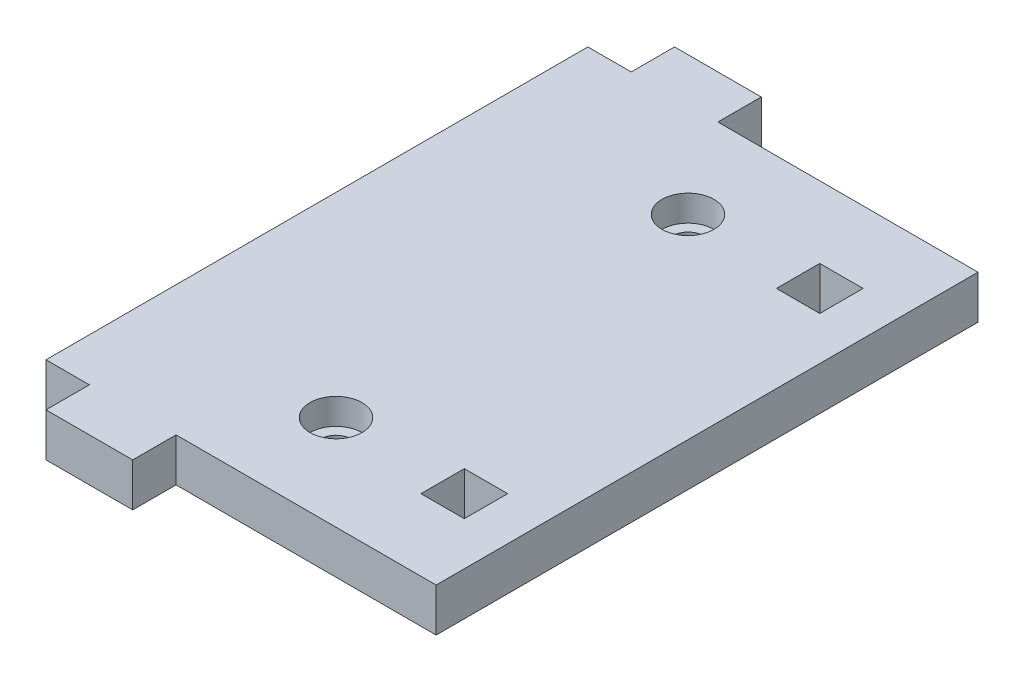
ISO-10303-21;
HEADER;
FILE_DESCRIPTION(('STEP AP214'),'2;1');
FILE_NAME('part.step','',(''),(''),'','','');
FILE_SCHEMA(('AUTOMOTIVE_DESIGN { 1 0 10303 214 1 1 1 1 }'));
ENDSEC;
DATA;
#1=APPLICATION_CONTEXT('core data for automotive mechanical design processes');
#2=APPLICATION_PROTOCOL_DEFINITION('international standard','automotive_design',2000,#1);
#3=PRODUCT_CONTEXT('',#1,'mechanical');
#4=PRODUCT('Part','Part','',(#3));
#5=PRODUCT_RELATED_PRODUCT_CATEGORY('part','',(#4));
#6=PRODUCT_DEFINITION_FORMATION('','',#4);
#7=PRODUCT_DEFINITION_CONTEXT('part definition',#1,'design');
#8=PRODUCT_DEFINITION('design','',#6,#7);
#9=PRODUCT_DEFINITION_SHAPE('','',#8);
#10=(LENGTH_UNIT() NAMED_UNIT(*) SI_UNIT(.MILLI.,.METRE.));
#11=(NAMED_UNIT(*) PLANE_ANGLE_UNIT() SI_UNIT($,.RADIAN.));
#12=(NAMED_UNIT(*) SI_UNIT($,.STERADIAN.) SOLID_ANGLE_UNIT());
#13=UNCERTAINTY_MEASURE_WITH_UNIT(LENGTH_MEASURE(1.E-05),#10,'distance_accuracy_value','');
#14=(GEOMETRIC_REPRESENTATION_CONTEXT(3) GLOBAL_UNCERTAINTY_ASSIGNED_CONTEXT((#13)) GLOBAL_UNIT_ASSIGNED_CONTEXT((#10,
#11,#12)) REPRESENTATION_CONTEXT('',''));
#15=CARTESIAN_POINT('',(0.,0.,0.));
#16=DIRECTION('',(0.,0.,1.));
#17=DIRECTION('',(1.,0.,0.));
#18=AXIS2_PLACEMENT_3D('',#15,#16,#17);
#19=CARTESIAN_POINT('',(0.590379008746339,5.,-8.53250728862974));
#20=DIRECTION('',(0.,-1.,0.));
#21=DIRECTION('',(0.,0.,-1.));
#22=AXIS2_PLACEMENT_3D('',#19,#20,#21);
#23=CYLINDRICAL_SURFACE('',#22,1.75);
#24=CARTESIAN_POINT('',(0.590379008746339,0.,-8.53250728862974));
#25=DIRECTION('',(0.,1.,0.));
#26=DIRECTION('',(0.,0.,1.));
#27=AXIS2_PLACEMENT_3D('',#24,#25,#26);
#28=CIRCLE('',#27,1.75);
#29=CARTESIAN_POINT('',(0.590379008746339,0.,-6.78250728862974));
#30=VERTEX_POINT('',#29);
#31=EDGE_CURVE('E271',#30,#30,#28,.T.);
#32=ORIENTED_EDGE('',*,*,#31,.F.);
#33=EDGE_LOOP('',(#32));
#34=FACE_BOUND('',#33,.T.);
#35=CARTESIAN_POINT('',(0.590379008746339,2.,-8.53250728862974));
#36=DIRECTION('',(0.,1.,0.));
#37=DIRECTION('',(0.,0.,1.));
#38=AXIS2_PLACEMENT_3D('',#35,#36,#37);
#39=CIRCLE('',#38,1.75);
#40=CARTESIAN_POINT('',(0.590379008746339,2.,-6.78250728862974));
#41=VERTEX_POINT('',#40);
#42=EDGE_CURVE('E43',#41,#41,#39,.T.);
#43=ORIENTED_EDGE('',*,*,#42,.T.);
#44=EDGE_LOOP('',(#43));
#45=FACE_BOUND('',#44,.T.);
#46=ADVANCED_FACE('F40',(#34,#45),#23,.F.);
#47=CARTESIAN_POINT('',(0.590379008746339,5.,32.0674927113702));
#48=DIRECTION('',(0.,-1.,0.));
#49=DIRECTION('',(0.,0.,-1.));
#50=AXIS2_PLACEMENT_3D('',#47,#48,#49);
#51=CYLINDRICAL_SURFACE('',#50,1.75);
#52=CARTESIAN_POINT('',(0.590379008746339,0.,32.0674927113702));
#53=DIRECTION('',(0.,1.,0.));
#54=DIRECTION('',(0.,0.,1.));
#55=AXIS2_PLACEMENT_3D('',#52,#53,#54);
#56=CIRCLE('',#55,1.75);
#57=CARTESIAN_POINT('',(0.590379008746339,0.,33.8174927113702));
#58=VERTEX_POINT('',#57);
#59=EDGE_CURVE('E292',#58,#58,#56,.F.);
#60=ORIENTED_EDGE('',*,*,#59,.T.);
#61=EDGE_LOOP('',(#60));
#62=FACE_BOUND('',#61,.T.);
#63=CARTESIAN_POINT('',(0.590379008746339,2.,32.0674927113702));
#64=DIRECTION('',(0.,1.,0.));
#65=DIRECTION('',(0.,0.,1.));
#66=AXIS2_PLACEMENT_3D('',#63,#64,#65);
#67=CIRCLE('',#66,1.75);
#68=CARTESIAN_POINT('',(0.590379008746339,2.,33.8174927113702));
#69=VERTEX_POINT('',#68);
#70=EDGE_CURVE('E262',#69,#69,#67,.F.);
#71=ORIENTED_EDGE('',*,*,#70,.F.);
#72=EDGE_LOOP('',(#71));
#73=FACE_BOUND('',#72,.T.);
#74=ADVANCED_FACE('F492',(#62,#73),#51,.F.);
#75=CARTESIAN_POINT('',(0.,5.,34.7674927113703));
#76=DIRECTION('',(0.,0.,-1.));
#77=DIRECTION('',(-1.,0.,0.));
#78=AXIS2_PLACEMENT_3D('',#75,#76,#77);
#79=PLANE('',#78);
#80=DIRECTION('',(1.,0.,0.));
#81=VECTOR('',#80,1.);
#82=CARTESIAN_POINT('',(0.,0.,34.7674927113703));
#83=LINE('',#82,#81);
#84=CARTESIAN_POINT('',(13.0903790087463,0.,34.7674927113703));
#85=VERTEX_POINT('',#84);
#86=CARTESIAN_POINT('',(18.0903790087463,0.,34.7674927113703));
#87=VERTEX_POINT('',#86);
#88=EDGE_CURVE('E404',#85,#87,#83,.T.);
#89=ORIENTED_EDGE('',*,*,#88,.F.);
#90=DIRECTION('',(0.,-1.,0.));
#91=VECTOR('',#90,1.);
#92=CARTESIAN_POINT('',(13.0903790087463,5.,34.7674927113703));
#93=LINE('',#92,#91);
#94=CARTESIAN_POINT('',(13.0903790087463,5.,34.7674927113703));
#95=VERTEX_POINT('',#94);
#96=EDGE_CURVE('E11',#95,#85,#93,.T.);
#97=ORIENTED_EDGE('',*,*,#96,.F.);
#98=DIRECTION('',(1.,0.,0.));
#99=VECTOR('',#98,1.);
#100=CARTESIAN_POINT('',(0.,5.,34.7674927113703));
#101=LINE('',#100,#99);
#102=CARTESIAN_POINT('',(18.0903790087463,5.,34.7674927113703));
#103=VERTEX_POINT('',#102);
#104=EDGE_CURVE('E199',#95,#103,#101,.T.);
#105=ORIENTED_EDGE('',*,*,#104,.T.);
#106=DIRECTION('',(0.,-1.,0.));
#107=VECTOR('',#106,1.);
#108=CARTESIAN_POINT('',(18.0903790087463,5.,34.7674927113703));
#109=LINE('',#108,#107);
#110=EDGE_CURVE('E59',#103,#87,#109,.T.);
#111=ORIENTED_EDGE('',*,*,#110,.T.);
#112=EDGE_LOOP('',(#89,#97,#105,#111));
#113=FACE_BOUND('',#112,.T.);
#114=ADVANCED_FACE('F497',(#113),#79,.T.);
#115=CARTESIAN_POINT('',(13.0903790087464,5.,0.));
#116=DIRECTION('',(-1.,0.,0.));
#117=DIRECTION('',(0.,0.,1.));
#118=AXIS2_PLACEMENT_3D('',#115,#116,#117);
#119=PLANE('',#118);
#120=DIRECTION('',(0.,0.,-1.));
#121=VECTOR('',#120,1.);
#122=CARTESIAN_POINT('',(13.0903790087464,0.,0.));
#123=LINE('',#122,#121);
#124=CARTESIAN_POINT('',(13.0903790087464,0.,29.7674927113703));
#125=VERTEX_POINT('',#124);
#126=EDGE_CURVE('E205',#85,#125,#123,.T.);
#127=ORIENTED_EDGE('',*,*,#126,.T.);
#128=DIRECTION('',(0.,-1.,0.));
#129=VECTOR('',#128,1.);
#130=CARTESIAN_POINT('',(13.0903790087464,5.,29.7674927113703));
#131=LINE('',#130,#129);
#132=CARTESIAN_POINT('',(13.0903790087464,5.,29.7674927113703));
#133=VERTEX_POINT('',#132);
#134=EDGE_CURVE('E50',#133,#125,#131,.T.);
#135=ORIENTED_EDGE('',*,*,#134,.F.);
#136=DIRECTION('',(0.,0.,-1.));
#137=VECTOR('',#136,1.);
#138=CARTESIAN_POINT('',(13.0903790087464,5.,0.));
#139=LINE('',#138,#137);
#140=EDGE_CURVE('E194',#95,#133,#139,.T.);
#141=ORIENTED_EDGE('',*,*,#140,.F.);
#142=ORIENTED_EDGE('',*,*,#96,.T.);
#143=EDGE_LOOP('',(#127,#135,#141,#142));
#144=FACE_BOUND('',#143,.T.);
#145=ADVANCED_FACE('F203',(#144),#119,.F.);
#146=CARTESIAN_POINT('',(0.,5.,29.7674927113703));
#147=DIRECTION('',(0.,0.,-1.));
#148=DIRECTION('',(-1.,0.,0.));
#149=AXIS2_PLACEMENT_3D('',#146,#147,#148);
#150=PLANE('',#149);
#151=DIRECTION('',(1.,0.,0.));
#152=VECTOR('',#151,1.);
#153=CARTESIAN_POINT('',(0.,0.,29.7674927113703));
#154=LINE('',#153,#152);
#155=CARTESIAN_POINT('',(18.0903790087464,0.,29.7674927113703));
#156=VERTEX_POINT('',#155);
#157=EDGE_CURVE('E409',#125,#156,#154,.T.);
#158=ORIENTED_EDGE('',*,*,#157,.T.);
#159=DIRECTION('',(0.,-1.,0.));
#160=VECTOR('',#159,1.);
#161=CARTESIAN_POINT('',(18.0903790087464,5.,29.7674927113703));
#162=LINE('',#161,#160);
#163=CARTESIAN_POINT('',(18.0903790087464,5.,29.7674927113703));
#164=VERTEX_POINT('',#163);
#165=EDGE_CURVE('E121',#164,#156,#162,.T.);
#166=ORIENTED_EDGE('',*,*,#165,.F.);
#167=DIRECTION('',(1.,0.,0.));
#168=VECTOR('',#167,1.);
#169=CARTESIAN_POINT('',(0.,5.,29.7674927113703));
#170=LINE('',#169,#168);
#171=EDGE_CURVE('E185',#133,#164,#170,.T.);
#172=ORIENTED_EDGE('',*,*,#171,.F.);
#173=ORIENTED_EDGE('',*,*,#134,.T.);
#174=EDGE_LOOP('',(#158,#166,#172,#173));
#175=FACE_BOUND('',#174,.T.);
#176=ADVANCED_FACE('F187',(#175),#150,.F.);
#177=CARTESIAN_POINT('',(-21.9096209912536,5.,0.));
#178=DIRECTION('',(1.,0.,0.));
#179=DIRECTION('',(0.,0.,-1.));
#180=AXIS2_PLACEMENT_3D('',#177,#178,#179);
#181=PLANE('',#180);
#182=DIRECTION('',(0.,0.,1.));
#183=VECTOR('',#182,1.);
#184=CARTESIAN_POINT('',(-21.9096209912536,0.,0.));
#185=LINE('',#184,#183);
#186=CARTESIAN_POINT('',(-21.9096209912536,0.,-19.4825072886297));
#187=VERTEX_POINT('',#186);
#188=CARTESIAN_POINT('',(-21.9096209912536,0.,43.0174927113703));
#189=VERTEX_POINT('',#188);
#190=EDGE_CURVE('E364',#187,#189,#185,.T.);
#191=ORIENTED_EDGE('',*,*,#190,.T.);
#192=DIRECTION('',(0.,-1.,0.));
#193=VECTOR('',#192,1.);
#194=CARTESIAN_POINT('',(-21.9096209912536,5.,43.0174927113703));
#195=LINE('',#194,#193);
#196=CARTESIAN_POINT('',(-21.9096209912536,5.,43.0174927113703));
#197=VERTEX_POINT('',#196);
#198=EDGE_CURVE('E248',#197,#189,#195,.T.);
#199=ORIENTED_EDGE('',*,*,#198,.F.);
#200=DIRECTION('',(0.,0.,1.));
#201=VECTOR('',#200,1.);
#202=CARTESIAN_POINT('',(-21.9096209912536,5.,0.));
#203=LINE('',#202,#201);
#204=CARTESIAN_POINT('',(-21.9096209912536,5.,-19.4825072886297));
#205=VERTEX_POINT('',#204);
#206=EDGE_CURVE('E303',#205,#197,#203,.T.);
#207=ORIENTED_EDGE('',*,*,#206,.F.);
#208=DIRECTION('',(0.,-1.,0.));
#209=VECTOR('',#208,1.);
#210=CARTESIAN_POINT('',(-21.9096209912536,5.,-19.4825072886297));
#211=LINE('',#210,#209);
#212=EDGE_CURVE('E212',#205,#187,#211,.T.);
#213=ORIENTED_EDGE('',*,*,#212,.T.);
#214=EDGE_LOOP('',(#191,#199,#207,#213));
#215=FACE_BOUND('',#214,.T.);
#216=ADVANCED_FACE('F466',(#215),#181,.F.);
#217=CARTESIAN_POINT('',(0.,5.,43.0174927113703));
#218=DIRECTION('',(0.,0.,-1.));
#219=DIRECTION('',(-1.,0.,0.));
#220=AXIS2_PLACEMENT_3D('',#217,#218,#219);
#221=PLANE('',#220);
#222=DIRECTION('',(1.,0.,0.));
#223=VECTOR('',#222,1.);
#224=CARTESIAN_POINT('',(0.,0.,43.0174927113703));
#225=LINE('',#224,#223);
#226=CARTESIAN_POINT('',(-16.9096209912536,0.,43.0174927113703));
#227=VERTEX_POINT('',#226);
#228=EDGE_CURVE('E368',#189,#227,#225,.T.);
#229=ORIENTED_EDGE('',*,*,#228,.T.);
#230=DIRECTION('',(0.,-1.,0.));
#231=VECTOR('',#230,1.);
#232=CARTESIAN_POINT('',(-16.9096209912536,5.,43.0174927113703));
#233=LINE('',#232,#231);
#234=CARTESIAN_POINT('',(-16.9096209912536,5.,43.0174927113703));
#235=VERTEX_POINT('',#234);
#236=EDGE_CURVE('E244',#235,#227,#233,.T.);
#237=ORIENTED_EDGE('',*,*,#236,.F.);
#238=DIRECTION('',(1.,0.,0.));
#239=VECTOR('',#238,1.);
#240=CARTESIAN_POINT('',(0.,5.,43.0174927113703));
#241=LINE('',#240,#239);
#242=EDGE_CURVE('E307',#197,#235,#241,.T.);
#243=ORIENTED_EDGE('',*,*,#242,.F.);
#244=ORIENTED_EDGE('',*,*,#198,.T.);
#245=EDGE_LOOP('',(#229,#237,#243,#244));
#246=FACE_BOUND('',#245,.T.);
#247=ADVANCED_FACE('F468',(#246),#221,.F.);
#248=CARTESIAN_POINT('',(-16.9096209912536,5.,0.));
#249=DIRECTION('',(1.,0.,0.));
#250=DIRECTION('',(0.,0.,-1.));
#251=AXIS2_PLACEMENT_3D('',#248,#249,#250);
#252=PLANE('',#251);
#253=DIRECTION('',(0.,0.,1.));
#254=VECTOR('',#253,1.);
#255=CARTESIAN_POINT('',(-16.9096209912536,0.,0.));
#256=LINE('',#255,#254);
#257=CARTESIAN_POINT('',(-16.9096209912536,0.,48.0174927113703));
#258=VERTEX_POINT('',#257);
#259=EDGE_CURVE('E371',#227,#258,#256,.T.);
#260=ORIENTED_EDGE('',*,*,#259,.T.);
#261=DIRECTION('',(0.,-1.,0.));
#262=VECTOR('',#261,1.);
#263=CARTESIAN_POINT('',(-16.9096209912536,5.,48.0174927113703));
#264=LINE('',#263,#262);
#265=CARTESIAN_POINT('',(-16.9096209912536,5.,48.0174927113703));
#266=VERTEX_POINT('',#265);
#267=EDGE_CURVE('E240',#266,#258,#264,.T.);
#268=ORIENTED_EDGE('',*,*,#267,.F.);
#269=DIRECTION('',(0.,0.,1.));
#270=VECTOR('',#269,1.);
#271=CARTESIAN_POINT('',(-16.9096209912536,5.,0.));
#272=LINE('',#271,#270);
#273=EDGE_CURVE('E310',#235,#266,#272,.T.);
#274=ORIENTED_EDGE('',*,*,#273,.F.);
#275=ORIENTED_EDGE('',*,*,#236,.T.);
#276=EDGE_LOOP('',(#260,#268,#274,#275));
#277=FACE_BOUND('',#276,.T.);
#278=ADVANCED_FACE('F473',(#277),#252,.F.);
#279=CARTESIAN_POINT('',(0.,5.,48.0174927113703));
#280=DIRECTION('',(0.,0.,-1.));
#281=DIRECTION('',(-1.,0.,0.));
#282=AXIS2_PLACEMENT_3D('',#279,#280,#281);
#283=PLANE('',#282);
#284=DIRECTION('',(1.,0.,0.));
#285=VECTOR('',#284,1.);
#286=CARTESIAN_POINT('',(0.,0.,48.0174927113703));
#287=LINE('',#286,#285);
#288=CARTESIAN_POINT('',(-6.90962099125364,0.,48.0174927113703));
#289=VERTEX_POINT('',#288);
#290=EDGE_CURVE('E375',#258,#289,#287,.T.);
#291=ORIENTED_EDGE('',*,*,#290,.T.);
#292=DIRECTION('',(0.,-1.,0.));
#293=VECTOR('',#292,1.);
#294=CARTESIAN_POINT('',(-6.90962099125364,5.,48.0174927113703));
#295=LINE('',#294,#293);
#296=CARTESIAN_POINT('',(-6.90962099125364,5.,48.0174927113703));
#297=VERTEX_POINT('',#296);
#298=EDGE_CURVE('E237',#297,#289,#295,.T.);
#299=ORIENTED_EDGE('',*,*,#298,.F.);
#300=DIRECTION('',(1.,0.,0.));
#301=VECTOR('',#300,1.);
#302=CARTESIAN_POINT('',(0.,5.,48.0174927113703));
#303=LINE('',#302,#301);
#304=EDGE_CURVE('E314',#266,#297,#303,.T.);
#305=ORIENTED_EDGE('',*,*,#304,.F.);
#306=ORIENTED_EDGE('',*,*,#267,.T.);
#307=EDGE_LOOP('',(#291,#299,#305,#306));
#308=FACE_BOUND('',#307,.T.);
#309=ADVANCED_FACE('F477',(#308),#283,.F.);
#310=CARTESIAN_POINT('',(-6.90962099125364,5.,0.));
#311=DIRECTION('',(1.,0.,0.));
#312=DIRECTION('',(0.,0.,-1.));
#313=AXIS2_PLACEMENT_3D('',#310,#311,#312);
#314=PLANE('',#313);
#315=DIRECTION('',(0.,0.,1.));
#316=VECTOR('',#315,1.);
#317=CARTESIAN_POINT('',(-6.90962099125364,0.,0.));
#318=LINE('',#317,#316);
#319=CARTESIAN_POINT('',(-6.90962099125364,0.,43.0174927113703));
#320=VERTEX_POINT('',#319);
#321=EDGE_CURVE('E379',#320,#289,#318,.T.);
#322=ORIENTED_EDGE('',*,*,#321,.F.);
#323=DIRECTION('',(0.,-1.,0.));
#324=VECTOR('',#323,1.);
#325=CARTESIAN_POINT('',(-6.90962099125364,5.,43.0174927113703));
#326=LINE('',#325,#324);
#327=CARTESIAN_POINT('',(-6.90962099125364,5.,43.0174927113703));
#328=VERTEX_POINT('',#327);
#329=EDGE_CURVE('E234',#328,#320,#326,.T.);
#330=ORIENTED_EDGE('',*,*,#329,.F.);
#331=DIRECTION('',(0.,0.,1.));
#332=VECTOR('',#331,1.);
#333=CARTESIAN_POINT('',(-6.90962099125364,5.,0.));
#334=LINE('',#333,#332);
#335=EDGE_CURVE('E317',#328,#297,#334,.T.);
#336=ORIENTED_EDGE('',*,*,#335,.T.);
#337=ORIENTED_EDGE('',*,*,#298,.T.);
#338=EDGE_LOOP('',(#322,#330,#336,#337));
#339=FACE_BOUND('',#338,.T.);
#340=ADVANCED_FACE('F480',(#339),#314,.T.);
#341=CARTESIAN_POINT('',(23.0903790087464,0.,43.0174927113703));
#342=VERTEX_POINT('',#341);
#343=EDGE_CURVE('E372',#320,#342,#225,.T.);
#344=ORIENTED_EDGE('',*,*,#343,.T.);
#345=DIRECTION('',(0.,-1.,0.));
#346=VECTOR('',#345,1.);
#347=CARTESIAN_POINT('',(23.0903790087464,5.,43.0174927113703));
#348=LINE('',#347,#346);
#349=CARTESIAN_POINT('',(23.0903790087464,5.,43.0174927113703));
#350=VERTEX_POINT('',#349);
#351=EDGE_CURVE('E231',#350,#342,#348,.T.);
#352=ORIENTED_EDGE('',*,*,#351,.F.);
#353=EDGE_CURVE('E311',#328,#350,#241,.T.);
#354=ORIENTED_EDGE('',*,*,#353,.F.);
#355=ORIENTED_EDGE('',*,*,#329,.T.);
#356=EDGE_LOOP('',(#344,#352,#354,#355));
#357=FACE_BOUND('',#356,.T.);
#358=ADVANCED_FACE('F429',(#357),#221,.F.);
#359=CARTESIAN_POINT('',(23.0903790087464,5.,0.));
#360=DIRECTION('',(1.,0.,0.));
#361=DIRECTION('',(0.,0.,-1.));
#362=AXIS2_PLACEMENT_3D('',#359,#360,#361);
#363=PLANE('',#362);
#364=DIRECTION('',(0.,0.,1.));
#365=VECTOR('',#364,1.);
#366=CARTESIAN_POINT('',(23.0903790087464,0.,0.));
#367=LINE('',#366,#365);
#368=CARTESIAN_POINT('',(23.0903790087464,0.,-19.4825072886297));
#369=VERTEX_POINT('',#368);
#370=EDGE_CURVE('E383',#369,#342,#367,.T.);
#371=ORIENTED_EDGE('',*,*,#370,.F.);
#372=DIRECTION('',(0.,-1.,0.));
#373=VECTOR('',#372,1.);
#374=CARTESIAN_POINT('',(23.0903790087464,5.,-19.4825072886297));
#375=LINE('',#374,#373);
#376=CARTESIAN_POINT('',(23.0903790087464,5.,-19.4825072886297));
#377=VERTEX_POINT('',#376);
#378=EDGE_CURVE('E228',#377,#369,#375,.T.);
#379=ORIENTED_EDGE('',*,*,#378,.F.);
#380=DIRECTION('',(0.,0.,1.));
#381=VECTOR('',#380,1.);
#382=CARTESIAN_POINT('',(23.0903790087464,5.,0.));
#383=LINE('',#382,#381);
#384=EDGE_CURVE('E321',#377,#350,#383,.T.);
#385=ORIENTED_EDGE('',*,*,#384,.T.);
#386=ORIENTED_EDGE('',*,*,#351,.T.);
#387=EDGE_LOOP('',(#371,#379,#385,#386));
#388=FACE_BOUND('',#387,.T.);
#389=ADVANCED_FACE('F440',(#388),#363,.T.);
#390=CARTESIAN_POINT('',(0.,5.,-19.4825072886297));
#391=DIRECTION('',(0.,0.,-1.));
#392=DIRECTION('',(-1.,0.,0.));
#393=AXIS2_PLACEMENT_3D('',#390,#391,#392);
#394=PLANE('',#393);
#395=DIRECTION('',(1.,0.,0.));
#396=VECTOR('',#395,1.);
#397=CARTESIAN_POINT('',(0.,0.,-19.4825072886297));
#398=LINE('',#397,#396);
#399=CARTESIAN_POINT('',(-6.90962099125364,0.,-19.4825072886297));
#400=VERTEX_POINT('',#399);
#401=EDGE_CURVE('E387',#400,#369,#398,.T.);
#402=ORIENTED_EDGE('',*,*,#401,.F.);
#403=DIRECTION('',(0.,-1.,0.));
#404=VECTOR('',#403,1.);
#405=CARTESIAN_POINT('',(-6.90962099125364,5.,-19.4825072886297));
#406=LINE('',#405,#404);
#407=CARTESIAN_POINT('',(-6.90962099125364,5.,-19.4825072886297));
#408=VERTEX_POINT('',#407);
#409=EDGE_CURVE('E225',#408,#400,#406,.T.);
#410=ORIENTED_EDGE('',*,*,#409,.F.);
#411=DIRECTION('',(1.,0.,0.));
#412=VECTOR('',#411,1.);
#413=CARTESIAN_POINT('',(0.,5.,-19.4825072886297));
#414=LINE('',#413,#412);
#415=EDGE_CURVE('E325',#408,#377,#414,.T.);
#416=ORIENTED_EDGE('',*,*,#415,.T.);
#417=ORIENTED_EDGE('',*,*,#378,.T.);
#418=EDGE_LOOP('',(#402,#410,#416,#417));
#419=FACE_BOUND('',#418,.T.);
#420=ADVANCED_FACE('F446',(#419),#394,.T.);
#421=CARTESIAN_POINT('',(-6.90962099125364,5.,0.));
#422=DIRECTION('',(-1.,0.,0.));
#423=DIRECTION('',(0.,0.,1.));
#424=AXIS2_PLACEMENT_3D('',#421,#422,#423);
#425=PLANE('',#424);
#426=DIRECTION('',(0.,0.,-1.));
#427=VECTOR('',#426,1.);
#428=CARTESIAN_POINT('',(-6.90962099125364,0.,0.));
#429=LINE('',#428,#427);
#430=CARTESIAN_POINT('',(-6.90962099125364,0.,-24.4825072886297));
#431=VERTEX_POINT('',#430);
#432=EDGE_CURVE('E391',#400,#431,#429,.T.);
#433=ORIENTED_EDGE('',*,*,#432,.T.);
#434=DIRECTION('',(0.,-1.,0.));
#435=VECTOR('',#434,1.);
#436=CARTESIAN_POINT('',(-6.90962099125364,5.,-24.4825072886297));
#437=LINE('',#436,#435);
#438=CARTESIAN_POINT('',(-6.90962099125364,5.,-24.4825072886297));
#439=VERTEX_POINT('',#438);
#440=EDGE_CURVE('E222',#439,#431,#437,.T.);
#441=ORIENTED_EDGE('',*,*,#440,.F.);
#442=DIRECTION('',(0.,0.,-1.));
#443=VECTOR('',#442,1.);
#444=CARTESIAN_POINT('',(-6.90962099125364,5.,0.));
#445=LINE('',#444,#443);
#446=EDGE_CURVE('E329',#408,#439,#445,.T.);
#447=ORIENTED_EDGE('',*,*,#446,.F.);
#448=ORIENTED_EDGE('',*,*,#409,.T.);
#449=EDGE_LOOP('',(#433,#441,#447,#448));
#450=FACE_BOUND('',#449,.T.);
#451=ADVANCED_FACE('F450',(#450),#425,.F.);
#452=CARTESIAN_POINT('',(0.,5.,-24.4825072886297));
#453=DIRECTION('',(0.,0.,-1.));
#454=DIRECTION('',(-1.,0.,0.));
#455=AXIS2_PLACEMENT_3D('',#452,#453,#454);
#456=PLANE('',#455);
#457=DIRECTION('',(1.,0.,0.));
#458=VECTOR('',#457,1.);
#459=CARTESIAN_POINT('',(0.,0.,-24.4825072886297));
#460=LINE('',#459,#458);
#461=CARTESIAN_POINT('',(-16.9096209912536,0.,-24.4825072886297));
#462=VERTEX_POINT('',#461);
#463=EDGE_CURVE('E396',#462,#431,#460,.T.);
#464=ORIENTED_EDGE('',*,*,#463,.F.);
#465=DIRECTION('',(0.,-1.,0.));
#466=VECTOR('',#465,1.);
#467=CARTESIAN_POINT('',(-16.9096209912536,5.,-24.4825072886297));
#468=LINE('',#467,#466);
#469=CARTESIAN_POINT('',(-16.9096209912536,5.,-24.4825072886297));
#470=VERTEX_POINT('',#469);
#471=EDGE_CURVE('E219',#470,#462,#468,.T.);
#472=ORIENTED_EDGE('',*,*,#471,.F.);
#473=DIRECTION('',(1.,0.,0.));
#474=VECTOR('',#473,1.);
#475=CARTESIAN_POINT('',(0.,5.,-24.4825072886297));
#476=LINE('',#475,#474);
#477=EDGE_CURVE('E333',#470,#439,#476,.T.);
#478=ORIENTED_EDGE('',*,*,#477,.T.);
#479=ORIENTED_EDGE('',*,*,#440,.T.);
#480=EDGE_LOOP('',(#464,#472,#478,#479));
#481=FACE_BOUND('',#480,.T.);
#482=ADVANCED_FACE('F481',(#481),#456,.T.);
#483=CARTESIAN_POINT('',(-16.9096209912536,5.,0.));
#484=DIRECTION('',(-1.,0.,0.));
#485=DIRECTION('',(0.,0.,1.));
#486=AXIS2_PLACEMENT_3D('',#483,#484,#485);
#487=PLANE('',#486);
#488=DIRECTION('',(0.,0.,-1.));
#489=VECTOR('',#488,1.);
#490=CARTESIAN_POINT('',(-16.9096209912536,0.,0.));
#491=LINE('',#490,#489);
#492=CARTESIAN_POINT('',(-16.9096209912536,0.,-19.4825072886297));
#493=VERTEX_POINT('',#492);
#494=EDGE_CURVE('E400',#493,#462,#491,.T.);
#495=ORIENTED_EDGE('',*,*,#494,.F.);
#496=DIRECTION('',(0.,-1.,0.));
#497=VECTOR('',#496,1.);
#498=CARTESIAN_POINT('',(-16.9096209912536,5.,-19.4825072886297));
#499=LINE('',#498,#497);
#500=CARTESIAN_POINT('',(-16.9096209912536,5.,-19.4825072886297));
#501=VERTEX_POINT('',#500);
#502=EDGE_CURVE('E215',#501,#493,#499,.T.);
#503=ORIENTED_EDGE('',*,*,#502,.F.);
#504=DIRECTION('',(0.,0.,-1.));
#505=VECTOR('',#504,1.);
#506=CARTESIAN_POINT('',(-16.9096209912536,5.,0.));
#507=LINE('',#506,#505);
#508=EDGE_CURVE('E337',#501,#470,#507,.T.);
#509=ORIENTED_EDGE('',*,*,#508,.T.);
#510=ORIENTED_EDGE('',*,*,#471,.T.);
#511=EDGE_LOOP('',(#495,#503,#509,#510));
#512=FACE_BOUND('',#511,.T.);
#513=ADVANCED_FACE('F457',(#512),#487,.T.);
#514=CARTESIAN_POINT('',(0.,5.,-11.2325072886298));
#515=DIRECTION('',(0.,0.,-1.));
#516=DIRECTION('',(-1.,0.,0.));
#517=AXIS2_PLACEMENT_3D('',#514,#515,#516);
#518=PLANE('',#517);
#519=DIRECTION('',(1.,0.,0.));
#520=VECTOR('',#519,1.);
#521=CARTESIAN_POINT('',(0.,0.,-11.2325072886298));
#522=LINE('',#521,#520);
#523=CARTESIAN_POINT('',(13.0903790087463,0.,-11.2325072886297));
#524=VERTEX_POINT('',#523);
#525=CARTESIAN_POINT('',(18.0903790087463,0.,-11.2325072886297));
#526=VERTEX_POINT('',#525);
#527=EDGE_CURVE('E348',#524,#526,#522,.T.);
#528=ORIENTED_EDGE('',*,*,#527,.T.);
#529=DIRECTION('',(0.,-1.,0.));
#530=VECTOR('',#529,1.);
#531=CARTESIAN_POINT('',(18.0903790087463,5.,-11.2325072886297));
#532=LINE('',#531,#530);
#533=CARTESIAN_POINT('',(18.0903790087463,5.,-11.2325072886297));
#534=VERTEX_POINT('',#533);
#535=EDGE_CURVE('E216',#534,#526,#532,.T.);
#536=ORIENTED_EDGE('',*,*,#535,.F.);
#537=DIRECTION('',(1.,0.,0.));
#538=VECTOR('',#537,1.);
#539=CARTESIAN_POINT('',(0.,5.,-11.2325072886298));
#540=LINE('',#539,#538);
#541=CARTESIAN_POINT('',(13.0903790087463,5.,-11.2325072886297));
#542=VERTEX_POINT('',#541);
#543=EDGE_CURVE('E289',#542,#534,#540,.T.);
#544=ORIENTED_EDGE('',*,*,#543,.F.);
#545=DIRECTION('',(0.,-1.,0.));
#546=VECTOR('',#545,1.);
#547=CARTESIAN_POINT('',(13.0903790087463,5.,-11.2325072886297));
#548=LINE('',#547,#546);
#549=EDGE_CURVE('E252',#542,#524,#548,.T.);
#550=ORIENTED_EDGE('',*,*,#549,.T.);
#551=EDGE_LOOP('',(#528,#536,#544,#550));
#552=FACE_BOUND('',#551,.T.);
#553=ADVANCED_FACE('F488',(#552),#518,.F.);
#554=CARTESIAN_POINT('',(18.0903790087464,5.,0.));
#555=DIRECTION('',(1.,0.,0.));
#556=DIRECTION('',(0.,0.,-1.));
#557=AXIS2_PLACEMENT_3D('',#554,#555,#556);
#558=PLANE('',#557);
#559=DIRECTION('',(0.,0.,1.));
#560=VECTOR('',#559,1.);
#561=CARTESIAN_POINT('',(18.0903790087464,0.,0.));
#562=LINE('',#561,#560);
#563=CARTESIAN_POINT('',(18.0903790087464,0.,-6.23250728862975));
#564=VERTEX_POINT('',#563);
#565=EDGE_CURVE('E352',#526,#564,#562,.T.);
#566=ORIENTED_EDGE('',*,*,#565,.T.);
#567=DIRECTION('',(0.,-1.,0.));
#568=VECTOR('',#567,1.);
#569=CARTESIAN_POINT('',(18.0903790087464,5.,-6.23250728862975));
#570=LINE('',#569,#568);
#571=CARTESIAN_POINT('',(18.0903790087464,5.,-6.23250728862975));
#572=VERTEX_POINT('',#571);
#573=EDGE_CURVE('E258',#572,#564,#570,.T.);
#574=ORIENTED_EDGE('',*,*,#573,.F.);
#575=DIRECTION('',(0.,0.,1.));
#576=VECTOR('',#575,1.);
#577=CARTESIAN_POINT('',(18.0903790087464,5.,0.));
#578=LINE('',#577,#576);
#579=EDGE_CURVE('E134',#534,#572,#578,.T.);
#580=ORIENTED_EDGE('',*,*,#579,.F.);
#581=ORIENTED_EDGE('',*,*,#535,.T.);
#582=EDGE_LOOP('',(#566,#574,#580,#581));
#583=FACE_BOUND('',#582,.T.);
#584=ADVANCED_FACE('F528',(#583),#558,.F.);
#585=CARTESIAN_POINT('',(0.,5.,-6.23250728862975));
#586=DIRECTION('',(0.,0.,-1.));
#587=DIRECTION('',(-1.,0.,0.));
#588=AXIS2_PLACEMENT_3D('',#585,#586,#587);
#589=PLANE('',#588);
#590=DIRECTION('',(1.,0.,0.));
#591=VECTOR('',#590,1.);
#592=CARTESIAN_POINT('',(0.,0.,-6.23250728862975));
#593=LINE('',#592,#591);
#594=CARTESIAN_POINT('',(13.0903790087464,0.,-6.23250728862975));
#595=VERTEX_POINT('',#594);
#596=EDGE_CURVE('E356',#595,#564,#593,.T.);
#597=ORIENTED_EDGE('',*,*,#596,.F.);
#598=DIRECTION('',(0.,-1.,0.));
#599=VECTOR('',#598,1.);
#600=CARTESIAN_POINT('',(13.0903790087464,5.,-6.23250728862975));
#601=LINE('',#600,#599);
#602=CARTESIAN_POINT('',(13.0903790087464,5.,-6.23250728862975));
#603=VERTEX_POINT('',#602);
#604=EDGE_CURVE('E255',#603,#595,#601,.T.);
#605=ORIENTED_EDGE('',*,*,#604,.F.);
#606=DIRECTION('',(1.,0.,0.));
#607=VECTOR('',#606,1.);
#608=CARTESIAN_POINT('',(0.,5.,-6.23250728862975));
#609=LINE('',#608,#607);
#610=EDGE_CURVE('E295',#603,#572,#609,.T.);
#611=ORIENTED_EDGE('',*,*,#610,.T.);
#612=ORIENTED_EDGE('',*,*,#573,.T.);
#613=EDGE_LOOP('',(#597,#605,#611,#612));
#614=FACE_BOUND('',#613,.T.);
#615=ADVANCED_FACE('F533',(#614),#589,.T.);
#616=CARTESIAN_POINT('',(18.0903790087464,5.,0.));
#617=DIRECTION('',(-1.,0.,0.));
#618=DIRECTION('',(0.,0.,1.));
#619=AXIS2_PLACEMENT_3D('',#616,#617,#618);
#620=PLANE('',#619);
#621=DIRECTION('',(0.,0.,-1.));
#622=VECTOR('',#621,1.);
#623=CARTESIAN_POINT('',(18.0903790087464,0.,0.));
#624=LINE('',#623,#622);
#625=EDGE_CURVE('E412',#87,#156,#624,.T.);
#626=ORIENTED_EDGE('',*,*,#625,.F.);
#627=ORIENTED_EDGE('',*,*,#110,.F.);
#628=DIRECTION('',(0.,0.,-1.));
#629=VECTOR('',#628,1.);
#630=CARTESIAN_POINT('',(18.0903790087464,5.,0.));
#631=LINE('',#630,#629);
#632=EDGE_CURVE('E193',#103,#164,#631,.T.);
#633=ORIENTED_EDGE('',*,*,#632,.T.);
#634=ORIENTED_EDGE('',*,*,#165,.T.);
#635=EDGE_LOOP('',(#626,#627,#633,#634));
#636=FACE_BOUND('',#635,.T.);
#637=ADVANCED_FACE('F540',(#636),#620,.T.);
#638=EDGE_CURVE('E392',#187,#493,#398,.T.);
#639=ORIENTED_EDGE('',*,*,#638,.F.);
#640=ORIENTED_EDGE('',*,*,#212,.F.);
#641=EDGE_CURVE('E330',#205,#501,#414,.T.);
#642=ORIENTED_EDGE('',*,*,#641,.T.);
#643=ORIENTED_EDGE('',*,*,#502,.T.);
#644=EDGE_LOOP('',(#639,#640,#642,#643));
#645=FACE_BOUND('',#644,.T.);
#646=ADVANCED_FACE('F461',(#645),#394,.T.);
#647=CARTESIAN_POINT('',(13.0903790087464,5.,0.));
#648=DIRECTION('',(1.,0.,0.));
#649=DIRECTION('',(0.,0.,-1.));
#650=AXIS2_PLACEMENT_3D('',#647,#648,#649);
#651=PLANE('',#650);
#652=DIRECTION('',(0.,0.,1.));
#653=VECTOR('',#652,1.);
#654=CARTESIAN_POINT('',(13.0903790087464,0.,0.));
#655=LINE('',#654,#653);
#656=EDGE_CURVE('E360',#524,#595,#655,.T.);
#657=ORIENTED_EDGE('',*,*,#656,.F.);
#658=ORIENTED_EDGE('',*,*,#549,.F.);
#659=DIRECTION('',(0.,0.,1.));
#660=VECTOR('',#659,1.);
#661=CARTESIAN_POINT('',(13.0903790087464,5.,0.));
#662=LINE('',#661,#660);
#663=EDGE_CURVE('E299',#542,#603,#662,.T.);
#664=ORIENTED_EDGE('',*,*,#663,.T.);
#665=ORIENTED_EDGE('',*,*,#604,.T.);
#666=EDGE_LOOP('',(#657,#658,#664,#665));
#667=FACE_BOUND('',#666,.T.);
#668=ADVANCED_FACE('F519',(#667),#651,.T.);
#669=CARTESIAN_POINT('',(0.,5.,0.));
#670=DIRECTION('',(0.,1.,0.));
#671=DIRECTION('',(0.,0.,1.));
#672=AXIS2_PLACEMENT_3D('',#669,#670,#671);
#673=PLANE('',#672);
#674=CARTESIAN_POINT('',(0.590379008746339,5.,32.0674927113702));
#675=DIRECTION('',(0.,1.,0.));
#676=DIRECTION('',(0.,0.,1.));
#677=AXIS2_PLACEMENT_3D('',#674,#675,#676);
#678=CIRCLE('',#677,3.);
#679=CARTESIAN_POINT('',(0.590379008746339,5.,35.0674927113703));
#680=VERTEX_POINT('',#679);
#681=EDGE_CURVE('E273',#680,#680,#678,.T.);
#682=ORIENTED_EDGE('',*,*,#681,.F.);
#683=EDGE_LOOP('',(#682));
#684=FACE_BOUND('',#683,.T.);
#685=CARTESIAN_POINT('',(0.590379008746339,5.,-8.53250728862974));
#686=DIRECTION('',(0.,1.,0.));
#687=DIRECTION('',(0.,0.,1.));
#688=AXIS2_PLACEMENT_3D('',#685,#686,#687);
#689=CIRCLE('',#688,3.);
#690=CARTESIAN_POINT('',(0.590379008746339,5.,-5.53250728862974));
#691=VERTEX_POINT('',#690);
#692=EDGE_CURVE('E285',#691,#691,#689,.T.);
#693=ORIENTED_EDGE('',*,*,#692,.F.);
#694=EDGE_LOOP('',(#693));
#695=FACE_BOUND('',#694,.T.);
#696=ORIENTED_EDGE('',*,*,#543,.T.);
#697=ORIENTED_EDGE('',*,*,#579,.T.);
#698=ORIENTED_EDGE('',*,*,#610,.F.);
#699=ORIENTED_EDGE('',*,*,#663,.F.);
#700=EDGE_LOOP('',(#696,#697,#698,#699));
#701=FACE_BOUND('',#700,.T.);
#702=ORIENTED_EDGE('',*,*,#206,.T.);
#703=ORIENTED_EDGE('',*,*,#242,.T.);
#704=ORIENTED_EDGE('',*,*,#273,.T.);
#705=ORIENTED_EDGE('',*,*,#304,.T.);
#706=ORIENTED_EDGE('',*,*,#335,.F.);
#707=ORIENTED_EDGE('',*,*,#353,.T.);
#708=ORIENTED_EDGE('',*,*,#384,.F.);
#709=ORIENTED_EDGE('',*,*,#415,.F.);
#710=ORIENTED_EDGE('',*,*,#446,.T.);
#711=ORIENTED_EDGE('',*,*,#477,.F.);
#712=ORIENTED_EDGE('',*,*,#508,.F.);
#713=ORIENTED_EDGE('',*,*,#641,.F.);
#714=EDGE_LOOP('',(#702,#703,#704,#705,#706,#707,#708,#709,#710,#711,#712,#713));
#715=FACE_BOUND('',#714,.T.);
#716=ORIENTED_EDGE('',*,*,#104,.F.);
#717=ORIENTED_EDGE('',*,*,#140,.T.);
#718=ORIENTED_EDGE('',*,*,#171,.T.);
#719=ORIENTED_EDGE('',*,*,#632,.F.);
#720=EDGE_LOOP('',(#716,#717,#718,#719));
#721=FACE_BOUND('',#720,.T.);
#722=ADVANCED_FACE('F198',(#684,#695,#701,#715,#721),#673,.T.);
#723=CARTESIAN_POINT('',(0.,0.,0.));
#724=DIRECTION('',(0.,1.,0.));
#725=DIRECTION('',(0.,0.,1.));
#726=AXIS2_PLACEMENT_3D('',#723,#724,#725);
#727=PLANE('',#726);
#728=ORIENTED_EDGE('',*,*,#31,.T.);
#729=EDGE_LOOP('',(#728));
#730=FACE_BOUND('',#729,.T.);
#731=ORIENTED_EDGE('',*,*,#527,.F.);
#732=ORIENTED_EDGE('',*,*,#656,.T.);
#733=ORIENTED_EDGE('',*,*,#596,.T.);
#734=ORIENTED_EDGE('',*,*,#565,.F.);
#735=EDGE_LOOP('',(#731,#732,#733,#734));
#736=FACE_BOUND('',#735,.T.);
#737=ORIENTED_EDGE('',*,*,#190,.F.);
#738=ORIENTED_EDGE('',*,*,#638,.T.);
#739=ORIENTED_EDGE('',*,*,#494,.T.);
#740=ORIENTED_EDGE('',*,*,#463,.T.);
#741=ORIENTED_EDGE('',*,*,#432,.F.);
#742=ORIENTED_EDGE('',*,*,#401,.T.);
#743=ORIENTED_EDGE('',*,*,#370,.T.);
#744=ORIENTED_EDGE('',*,*,#343,.F.);
#745=ORIENTED_EDGE('',*,*,#321,.T.);
#746=ORIENTED_EDGE('',*,*,#290,.F.);
#747=ORIENTED_EDGE('',*,*,#259,.F.);
#748=ORIENTED_EDGE('',*,*,#228,.F.);
#749=EDGE_LOOP('',(#737,#738,#739,#740,#741,#742,#743,#744,#745,#746,#747,#748));
#750=FACE_BOUND('',#749,.T.);
#751=ORIENTED_EDGE('',*,*,#88,.T.);
#752=ORIENTED_EDGE('',*,*,#625,.T.);
#753=ORIENTED_EDGE('',*,*,#157,.F.);
#754=ORIENTED_EDGE('',*,*,#126,.F.);
#755=EDGE_LOOP('',(#751,#752,#753,#754));
#756=FACE_BOUND('',#755,.T.);
#757=ORIENTED_EDGE('',*,*,#59,.F.);
#758=EDGE_LOOP('',(#757));
#759=FACE_BOUND('',#758,.T.);
#760=ADVANCED_FACE('F435',(#730,#736,#750,#756,#759),#727,.F.);
#761=CARTESIAN_POINT('',(0.590379008746339,2.,-8.53250728862974));
#762=DIRECTION('',(0.,1.,0.));
#763=DIRECTION('',(0.,0.,1.));
#764=AXIS2_PLACEMENT_3D('',#761,#762,#763);
#765=CYLINDRICAL_SURFACE('',#764,3.);
#766=CARTESIAN_POINT('',(0.590379008746339,2.,-8.53250728862974));
#767=DIRECTION('',(0.,1.,0.));
#768=DIRECTION('',(0.,0.,1.));
#769=AXIS2_PLACEMENT_3D('',#766,#767,#768);
#770=CIRCLE('',#769,3.);
#771=CARTESIAN_POINT('',(0.590379008746339,2.,-5.53250728862974));
#772=VERTEX_POINT('',#771);
#773=EDGE_CURVE('E279',#772,#772,#770,.T.);
#774=ORIENTED_EDGE('',*,*,#773,.F.);
#775=EDGE_LOOP('',(#774));
#776=FACE_BOUND('',#775,.T.);
#777=ORIENTED_EDGE('',*,*,#692,.T.);
#778=EDGE_LOOP('',(#777));
#779=FACE_BOUND('',#778,.T.);
#780=ADVANCED_FACE('F508',(#776,#779),#765,.F.);
#781=CARTESIAN_POINT('',(0.590379008746339,2.,-8.53250728862974));
#782=DIRECTION('',(0.,1.,0.));
#783=DIRECTION('',(0.,0.,1.));
#784=AXIS2_PLACEMENT_3D('',#781,#782,#783);
#785=PLANE('',#784);
#786=ORIENTED_EDGE('',*,*,#42,.F.);
#787=EDGE_LOOP('',(#786));
#788=FACE_BOUND('',#787,.T.);
#789=ORIENTED_EDGE('',*,*,#773,.T.);
#790=EDGE_LOOP('',(#789));
#791=FACE_BOUND('',#790,.T.);
#792=ADVANCED_FACE('F504',(#788,#791),#785,.T.);
#793=CARTESIAN_POINT('',(0.590379008746339,2.,32.0674927113702));
#794=DIRECTION('',(0.,1.,0.));
#795=DIRECTION('',(0.,0.,1.));
#796=AXIS2_PLACEMENT_3D('',#793,#794,#795);
#797=PLANE('',#796);
#798=CARTESIAN_POINT('',(0.590379008746339,2.,32.0674927113702));
#799=DIRECTION('',(0.,1.,0.));
#800=DIRECTION('',(0.,0.,1.));
#801=AXIS2_PLACEMENT_3D('',#798,#799,#800);
#802=CIRCLE('',#801,3.);
#803=CARTESIAN_POINT('',(0.590379008746339,2.,35.0674927113703));
#804=VERTEX_POINT('',#803);
#805=EDGE_CURVE('E265',#804,#804,#802,.T.);
#806=ORIENTED_EDGE('',*,*,#805,.T.);
#807=EDGE_LOOP('',(#806));
#808=FACE_BOUND('',#807,.T.);
#809=ORIENTED_EDGE('',*,*,#70,.T.);
#810=EDGE_LOOP('',(#809));
#811=FACE_BOUND('',#810,.T.);
#812=ADVANCED_FACE('F507',(#808,#811),#797,.T.);
#813=CARTESIAN_POINT('',(0.590379008746339,2.,32.0674927113702));
#814=DIRECTION('',(0.,1.,0.));
#815=DIRECTION('',(0.,0.,1.));
#816=AXIS2_PLACEMENT_3D('',#813,#814,#815);
#817=CYLINDRICAL_SURFACE('',#816,3.);
#818=ORIENTED_EDGE('',*,*,#805,.F.);
#819=EDGE_LOOP('',(#818));
#820=FACE_BOUND('',#819,.T.);
#821=ORIENTED_EDGE('',*,*,#681,.T.);
#822=EDGE_LOOP('',(#821));
#823=FACE_BOUND('',#822,.T.);
#824=ADVANCED_FACE('F627',(#820,#823),#817,.F.);
#825=CLOSED_SHELL('',(#46,#74,#114,#145,#176,#216,#247,#278,#309,#340,#358,#389,#420,#451,#482,
#513,#553,#584,#615,#637,#646,#668,#722,#760,#780,#792,#812,#824));
#826=MANIFOLD_SOLID_BREP('B2',#825);
#827=ADVANCED_BREP_SHAPE_REPRESENTATION('',(#18,#826),#14);
#828=SHAPE_DEFINITION_REPRESENTATION(#9,#827);
ENDSEC;
END-ISO-10303-21;
